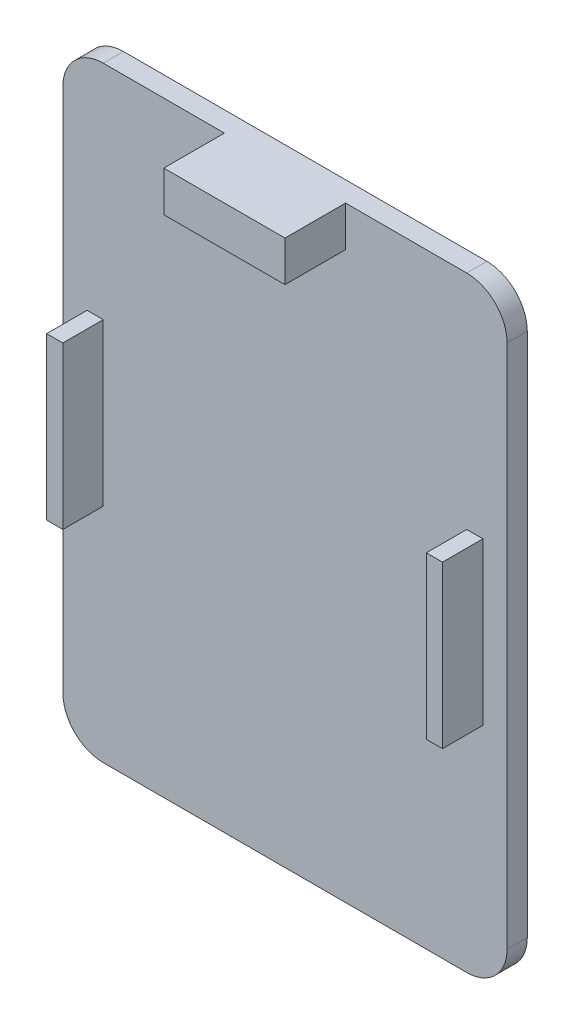
ISO-10303-21;
HEADER;
FILE_DESCRIPTION(('STEP AP214'),'2;1');
FILE_NAME('part.step','',(''),(''),'','','');
FILE_SCHEMA(('AUTOMOTIVE_DESIGN { 1 0 10303 214 1 1 1 1 }'));
ENDSEC;
DATA;
#1=APPLICATION_CONTEXT('core data for automotive mechanical design processes');
#2=APPLICATION_PROTOCOL_DEFINITION('international standard','automotive_design',2000,#1);
#3=PRODUCT_CONTEXT('',#1,'mechanical');
#4=PRODUCT('Part','Part','',(#3));
#5=PRODUCT_RELATED_PRODUCT_CATEGORY('part','',(#4));
#6=PRODUCT_DEFINITION_FORMATION('','',#4);
#7=PRODUCT_DEFINITION_CONTEXT('part definition',#1,'design');
#8=PRODUCT_DEFINITION('design','',#6,#7);
#9=PRODUCT_DEFINITION_SHAPE('','',#8);
#10=(LENGTH_UNIT() NAMED_UNIT(*) SI_UNIT(.MILLI.,.METRE.));
#11=(NAMED_UNIT(*) PLANE_ANGLE_UNIT() SI_UNIT($,.RADIAN.));
#12=(NAMED_UNIT(*) SI_UNIT($,.STERADIAN.) SOLID_ANGLE_UNIT());
#13=UNCERTAINTY_MEASURE_WITH_UNIT(LENGTH_MEASURE(1.E-05),#10,'distance_accuracy_value','');
#14=(GEOMETRIC_REPRESENTATION_CONTEXT(3) GLOBAL_UNCERTAINTY_ASSIGNED_CONTEXT((#13)) GLOBAL_UNIT_ASSIGNED_CONTEXT((#10,
#11,#12)) REPRESENTATION_CONTEXT('',''));
#15=CARTESIAN_POINT('',(0.,0.,0.));
#16=DIRECTION('',(0.,0.,1.));
#17=DIRECTION('',(1.,0.,0.));
#18=AXIS2_PLACEMENT_3D('',#15,#16,#17);
#19=CARTESIAN_POINT('',(4.5,6.5,0.5));
#20=DIRECTION('',(0.,0.,-1.));
#21=DIRECTION('',(-1.,0.,0.));
#22=AXIS2_PLACEMENT_3D('',#19,#20,#21);
#23=PLANE('',#22);
#24=DIRECTION('',(1.,0.,0.));
#25=VECTOR('',#24,1.);
#26=CARTESIAN_POINT('',(4.9,2.,0.5));
#27=LINE('',#26,#25);
#28=CARTESIAN_POINT('',(4.5,2.,0.5));
#29=VERTEX_POINT('',#28);
#30=CARTESIAN_POINT('',(4.9,2.,0.5));
#31=VERTEX_POINT('',#30);
#32=EDGE_CURVE('E204',#29,#31,#27,.T.);
#33=ORIENTED_EDGE('',*,*,#32,.T.);
#34=DIRECTION('',(0.,-1.,0.));
#35=VECTOR('',#34,1.);
#36=CARTESIAN_POINT('',(4.9,2.,0.5));
#37=LINE('',#36,#35);
#38=CARTESIAN_POINT('',(4.9,-2.,0.5));
#39=VERTEX_POINT('',#38);
#40=EDGE_CURVE('E178',#31,#39,#37,.T.);
#41=ORIENTED_EDGE('',*,*,#40,.T.);
#42=DIRECTION('',(-1.,0.,0.));
#43=VECTOR('',#42,1.);
#44=CARTESIAN_POINT('',(4.9,-2.,0.5));
#45=LINE('',#44,#43);
#46=CARTESIAN_POINT('',(4.5,-2.,0.5));
#47=VERTEX_POINT('',#46);
#48=EDGE_CURVE('E194',#39,#47,#45,.T.);
#49=ORIENTED_EDGE('',*,*,#48,.T.);
#50=DIRECTION('',(0.,1.,0.));
#51=VECTOR('',#50,1.);
#52=CARTESIAN_POINT('',(4.5,2.,0.5));
#53=LINE('',#52,#51);
#54=EDGE_CURVE('E50',#47,#29,#53,.T.);
#55=ORIENTED_EDGE('',*,*,#54,.T.);
#56=EDGE_LOOP('',(#33,#41,#49,#55));
#57=FACE_BOUND('',#56,.T.);
#58=DIRECTION('',(0.,-1.,0.));
#59=VECTOR('',#58,1.);
#60=CARTESIAN_POINT('',(-1.5,7.5,0.5));
#61=LINE('',#60,#59);
#62=CARTESIAN_POINT('',(-1.5,7.5,0.5));
#63=VERTEX_POINT('',#62);
#64=CARTESIAN_POINT('',(-1.5,6.5,0.5));
#65=VERTEX_POINT('',#64);
#66=EDGE_CURVE('E242',#63,#65,#61,.T.);
#67=ORIENTED_EDGE('',*,*,#66,.F.);
#68=DIRECTION('',(-1.,0.,0.));
#69=VECTOR('',#68,1.);
#70=CARTESIAN_POINT('',(-4.49999999999999,7.5,0.5));
#71=LINE('',#70,#69);
#72=CARTESIAN_POINT('',(-4.49999999999999,7.5,0.5));
#73=VERTEX_POINT('',#72);
#74=EDGE_CURVE('E282',#63,#73,#71,.T.);
#75=ORIENTED_EDGE('',*,*,#74,.T.);
#76=CARTESIAN_POINT('',(-4.5,6.5,0.5));
#77=DIRECTION('',(0.,0.,1.));
#78=DIRECTION('',(1.,0.,0.));
#79=AXIS2_PLACEMENT_3D('',#76,#77,#78);
#80=CIRCLE('',#79,1.);
#81=CARTESIAN_POINT('',(-5.5,6.49999999999999,0.5));
#82=VERTEX_POINT('',#81);
#83=EDGE_CURVE('E290',#73,#82,#80,.T.);
#84=ORIENTED_EDGE('',*,*,#83,.T.);
#85=DIRECTION('',(0.,-1.,0.));
#86=VECTOR('',#85,1.);
#87=CARTESIAN_POINT('',(-5.5,-6.5,0.5));
#88=LINE('',#87,#86);
#89=CARTESIAN_POINT('',(-5.5,-6.5,0.5));
#90=VERTEX_POINT('',#89);
#91=EDGE_CURVE('E293',#82,#90,#88,.T.);
#92=ORIENTED_EDGE('',*,*,#91,.T.);
#93=CARTESIAN_POINT('',(-4.5,-6.5,0.5));
#94=DIRECTION('',(0.,0.,1.));
#95=DIRECTION('',(-1.,0.,0.));
#96=AXIS2_PLACEMENT_3D('',#93,#94,#95);
#97=CIRCLE('',#96,1.);
#98=CARTESIAN_POINT('',(-4.49999999999999,-7.5,0.5));
#99=VERTEX_POINT('',#98);
#100=EDGE_CURVE('E295',#90,#99,#97,.T.);
#101=ORIENTED_EDGE('',*,*,#100,.T.);
#102=DIRECTION('',(1.,0.,0.));
#103=VECTOR('',#102,1.);
#104=CARTESIAN_POINT('',(-4.49999999999999,-7.5,0.5));
#105=LINE('',#104,#103);
#106=CARTESIAN_POINT('',(4.49999999999999,-7.5,0.5));
#107=VERTEX_POINT('',#106);
#108=EDGE_CURVE('E297',#99,#107,#105,.T.);
#109=ORIENTED_EDGE('',*,*,#108,.T.);
#110=CARTESIAN_POINT('',(4.5,-6.5,0.5));
#111=DIRECTION('',(0.,0.,1.));
#112=DIRECTION('',(-1.,0.,0.));
#113=AXIS2_PLACEMENT_3D('',#110,#111,#112);
#114=CIRCLE('',#113,1.);
#115=CARTESIAN_POINT('',(5.5,-6.5,0.5));
#116=VERTEX_POINT('',#115);
#117=EDGE_CURVE('E299',#107,#116,#114,.T.);
#118=ORIENTED_EDGE('',*,*,#117,.T.);
#119=DIRECTION('',(0.,1.,0.));
#120=VECTOR('',#119,1.);
#121=CARTESIAN_POINT('',(5.5,-6.5,0.5));
#122=LINE('',#121,#120);
#123=CARTESIAN_POINT('',(5.5,6.49999999999999,0.5));
#124=VERTEX_POINT('',#123);
#125=EDGE_CURVE('E301',#116,#124,#122,.T.);
#126=ORIENTED_EDGE('',*,*,#125,.T.);
#127=CARTESIAN_POINT('',(4.5,6.5,0.5));
#128=DIRECTION('',(0.,0.,1.));
#129=DIRECTION('',(-1.,0.,0.));
#130=AXIS2_PLACEMENT_3D('',#127,#128,#129);
#131=CIRCLE('',#130,1.);
#132=CARTESIAN_POINT('',(4.49999999999999,7.5,0.5));
#133=VERTEX_POINT('',#132);
#134=EDGE_CURVE('E286',#124,#133,#131,.T.);
#135=ORIENTED_EDGE('',*,*,#134,.T.);
#136=CARTESIAN_POINT('',(1.5,7.5,0.5));
#137=VERTEX_POINT('',#136);
#138=EDGE_CURVE('E285',#133,#137,#71,.T.);
#139=ORIENTED_EDGE('',*,*,#138,.T.);
#140=DIRECTION('',(0.,1.,0.));
#141=VECTOR('',#140,1.);
#142=CARTESIAN_POINT('',(1.5,7.5,0.5));
#143=LINE('',#142,#141);
#144=CARTESIAN_POINT('',(1.5,6.5,0.5));
#145=VERTEX_POINT('',#144);
#146=EDGE_CURVE('E247',#145,#137,#143,.T.);
#147=ORIENTED_EDGE('',*,*,#146,.F.);
#148=DIRECTION('',(1.,0.,0.));
#149=VECTOR('',#148,1.);
#150=CARTESIAN_POINT('',(-1.5,6.5,0.5));
#151=LINE('',#150,#149);
#152=EDGE_CURVE('E254',#65,#145,#151,.T.);
#153=ORIENTED_EDGE('',*,*,#152,.F.);
#154=EDGE_LOOP('',(#67,#75,#84,#92,#101,#109,#118,#126,#135,#139,#147,#153));
#155=FACE_BOUND('',#154,.T.);
#156=DIRECTION('',(0.,-1.,0.));
#157=VECTOR('',#156,1.);
#158=CARTESIAN_POINT('',(-4.9,2.,0.5));
#159=LINE('',#158,#157);
#160=CARTESIAN_POINT('',(-4.9,2.,0.5));
#161=VERTEX_POINT('',#160);
#162=CARTESIAN_POINT('',(-4.9,-2.,0.5));
#163=VERTEX_POINT('',#162);
#164=EDGE_CURVE('E183',#161,#163,#159,.T.);
#165=ORIENTED_EDGE('',*,*,#164,.F.);
#166=DIRECTION('',(-1.,0.,0.));
#167=VECTOR('',#166,1.);
#168=CARTESIAN_POINT('',(-4.9,2.,0.5));
#169=LINE('',#168,#167);
#170=CARTESIAN_POINT('',(-4.5,2.,0.5));
#171=VERTEX_POINT('',#170);
#172=EDGE_CURVE('E217',#171,#161,#169,.T.);
#173=ORIENTED_EDGE('',*,*,#172,.F.);
#174=DIRECTION('',(0.,1.,0.));
#175=VECTOR('',#174,1.);
#176=CARTESIAN_POINT('',(-4.5,2.,0.5));
#177=LINE('',#176,#175);
#178=CARTESIAN_POINT('',(-4.5,-2.,0.5));
#179=VERTEX_POINT('',#178);
#180=EDGE_CURVE('E227',#179,#171,#177,.T.);
#181=ORIENTED_EDGE('',*,*,#180,.F.);
#182=DIRECTION('',(1.,0.,0.));
#183=VECTOR('',#182,1.);
#184=CARTESIAN_POINT('',(-4.9,-2.,0.5));
#185=LINE('',#184,#183);
#186=EDGE_CURVE('E58',#163,#179,#185,.T.);
#187=ORIENTED_EDGE('',*,*,#186,.F.);
#188=EDGE_LOOP('',(#165,#173,#181,#187));
#189=FACE_BOUND('',#188,.T.);
#190=ADVANCED_FACE('F33',(#57,#155,#189),#23,.F.);
#191=CARTESIAN_POINT('',(4.5,6.5,0.5));
#192=DIRECTION('',(0.,0.,-1.));
#193=DIRECTION('',(-1.,0.,0.));
#194=AXIS2_PLACEMENT_3D('',#191,#192,#193);
#195=CYLINDRICAL_SURFACE('',#194,1.);
#196=CARTESIAN_POINT('',(4.5,6.5,0.));
#197=DIRECTION('',(0.,0.,1.));
#198=DIRECTION('',(-1.,0.,0.));
#199=AXIS2_PLACEMENT_3D('',#196,#197,#198);
#200=CIRCLE('',#199,1.);
#201=CARTESIAN_POINT('',(5.5,6.49999999999999,0.));
#202=VERTEX_POINT('',#201);
#203=CARTESIAN_POINT('',(4.49999999999999,7.5,0.));
#204=VERTEX_POINT('',#203);
#205=EDGE_CURVE('E304',#202,#204,#200,.T.);
#206=ORIENTED_EDGE('',*,*,#205,.T.);
#207=DIRECTION('',(0.,0.,-1.));
#208=VECTOR('',#207,1.);
#209=CARTESIAN_POINT('',(4.49999999999999,7.5,0.5));
#210=LINE('',#209,#208);
#211=EDGE_CURVE('E11',#133,#204,#210,.T.);
#212=ORIENTED_EDGE('',*,*,#211,.F.);
#213=ORIENTED_EDGE('',*,*,#134,.F.);
#214=DIRECTION('',(0.,0.,-1.));
#215=VECTOR('',#214,1.);
#216=CARTESIAN_POINT('',(5.5,6.49999999999999,0.5));
#217=LINE('',#216,#215);
#218=EDGE_CURVE('E303',#124,#202,#217,.T.);
#219=ORIENTED_EDGE('',*,*,#218,.T.);
#220=EDGE_LOOP('',(#206,#212,#213,#219));
#221=FACE_BOUND('',#220,.T.);
#222=ADVANCED_FACE('F35',(#221),#195,.T.);
#223=CARTESIAN_POINT('',(-4.49999999999999,7.5,0.5));
#224=DIRECTION('',(0.,-1.,0.));
#225=DIRECTION('',(0.,0.,-1.));
#226=AXIS2_PLACEMENT_3D('',#223,#224,#225);
#227=PLANE('',#226);
#228=DIRECTION('',(-1.,0.,0.));
#229=VECTOR('',#228,1.);
#230=CARTESIAN_POINT('',(-4.49999999999999,7.5,0.));
#231=LINE('',#230,#229);
#232=CARTESIAN_POINT('',(-4.49999999999999,7.5,0.));
#233=VERTEX_POINT('',#232);
#234=EDGE_CURVE('E307',#204,#233,#231,.T.);
#235=ORIENTED_EDGE('',*,*,#234,.T.);
#236=DIRECTION('',(0.,0.,-1.));
#237=VECTOR('',#236,1.);
#238=CARTESIAN_POINT('',(-4.49999999999999,7.5,0.5));
#239=LINE('',#238,#237);
#240=EDGE_CURVE('E42',#73,#233,#239,.T.);
#241=ORIENTED_EDGE('',*,*,#240,.F.);
#242=ORIENTED_EDGE('',*,*,#74,.F.);
#243=DIRECTION('',(0.,0.,-1.));
#244=VECTOR('',#243,1.);
#245=CARTESIAN_POINT('',(-1.5,7.5,2.));
#246=LINE('',#245,#244);
#247=CARTESIAN_POINT('',(-1.5,7.5,2.));
#248=VERTEX_POINT('',#247);
#249=EDGE_CURVE('E253',#248,#63,#246,.T.);
#250=ORIENTED_EDGE('',*,*,#249,.F.);
#251=DIRECTION('',(-1.,0.,0.));
#252=VECTOR('',#251,1.);
#253=CARTESIAN_POINT('',(-1.5,7.5,2.));
#254=LINE('',#253,#252);
#255=CARTESIAN_POINT('',(1.5,7.5,2.));
#256=VERTEX_POINT('',#255);
#257=EDGE_CURVE('E251',#256,#248,#254,.T.);
#258=ORIENTED_EDGE('',*,*,#257,.F.);
#259=DIRECTION('',(0.,0.,-1.));
#260=VECTOR('',#259,1.);
#261=CARTESIAN_POINT('',(1.5,7.5,2.));
#262=LINE('',#261,#260);
#263=EDGE_CURVE('E266',#256,#137,#262,.T.);
#264=ORIENTED_EDGE('',*,*,#263,.T.);
#265=ORIENTED_EDGE('',*,*,#138,.F.);
#266=ORIENTED_EDGE('',*,*,#211,.T.);
#267=EDGE_LOOP('',(#235,#241,#242,#250,#258,#264,#265,#266));
#268=FACE_BOUND('',#267,.T.);
#269=ADVANCED_FACE('F363',(#268),#227,.F.);
#270=CARTESIAN_POINT('',(-4.5,6.5,0.5));
#271=DIRECTION('',(0.,0.,-1.));
#272=DIRECTION('',(-1.,0.,0.));
#273=AXIS2_PLACEMENT_3D('',#270,#271,#272);
#274=CYLINDRICAL_SURFACE('',#273,1.);
#275=CARTESIAN_POINT('',(-4.5,6.5,0.));
#276=DIRECTION('',(0.,0.,1.));
#277=DIRECTION('',(1.,0.,0.));
#278=AXIS2_PLACEMENT_3D('',#275,#276,#277);
#279=CIRCLE('',#278,1.);
#280=CARTESIAN_POINT('',(-5.5,6.49999999999999,0.));
#281=VERTEX_POINT('',#280);
#282=EDGE_CURVE('E309',#233,#281,#279,.T.);
#283=ORIENTED_EDGE('',*,*,#282,.T.);
#284=DIRECTION('',(0.,0.,-1.));
#285=VECTOR('',#284,1.);
#286=CARTESIAN_POINT('',(-5.5,6.49999999999999,0.5));
#287=LINE('',#286,#285);
#288=EDGE_CURVE('E335',#82,#281,#287,.T.);
#289=ORIENTED_EDGE('',*,*,#288,.F.);
#290=ORIENTED_EDGE('',*,*,#83,.F.);
#291=ORIENTED_EDGE('',*,*,#240,.T.);
#292=EDGE_LOOP('',(#283,#289,#290,#291));
#293=FACE_BOUND('',#292,.T.);
#294=ADVANCED_FACE('F343',(#293),#274,.T.);
#295=CARTESIAN_POINT('',(-5.5,-6.5,0.5));
#296=DIRECTION('',(1.,0.,0.));
#297=DIRECTION('',(0.,0.,-1.));
#298=AXIS2_PLACEMENT_3D('',#295,#296,#297);
#299=PLANE('',#298);
#300=DIRECTION('',(0.,-1.,0.));
#301=VECTOR('',#300,1.);
#302=CARTESIAN_POINT('',(-5.5,-6.5,0.));
#303=LINE('',#302,#301);
#304=CARTESIAN_POINT('',(-5.5,-6.5,0.));
#305=VERTEX_POINT('',#304);
#306=EDGE_CURVE('E311',#281,#305,#303,.T.);
#307=ORIENTED_EDGE('',*,*,#306,.T.);
#308=DIRECTION('',(0.,0.,-1.));
#309=VECTOR('',#308,1.);
#310=CARTESIAN_POINT('',(-5.5,-6.5,0.5));
#311=LINE('',#310,#309);
#312=EDGE_CURVE('E332',#90,#305,#311,.T.);
#313=ORIENTED_EDGE('',*,*,#312,.F.);
#314=ORIENTED_EDGE('',*,*,#91,.F.);
#315=ORIENTED_EDGE('',*,*,#288,.T.);
#316=EDGE_LOOP('',(#307,#313,#314,#315));
#317=FACE_BOUND('',#316,.T.);
#318=ADVANCED_FACE('F354',(#317),#299,.F.);
#319=CARTESIAN_POINT('',(-4.5,-6.5,0.5));
#320=DIRECTION('',(0.,0.,-1.));
#321=DIRECTION('',(-1.,0.,0.));
#322=AXIS2_PLACEMENT_3D('',#319,#320,#321);
#323=CYLINDRICAL_SURFACE('',#322,1.);
#324=CARTESIAN_POINT('',(-4.5,-6.5,0.));
#325=DIRECTION('',(0.,0.,1.));
#326=DIRECTION('',(-1.,0.,0.));
#327=AXIS2_PLACEMENT_3D('',#324,#325,#326);
#328=CIRCLE('',#327,1.);
#329=CARTESIAN_POINT('',(-4.49999999999999,-7.5,0.));
#330=VERTEX_POINT('',#329);
#331=EDGE_CURVE('E313',#305,#330,#328,.T.);
#332=ORIENTED_EDGE('',*,*,#331,.T.);
#333=DIRECTION('',(0.,0.,-1.));
#334=VECTOR('',#333,1.);
#335=CARTESIAN_POINT('',(-4.49999999999999,-7.5,0.5));
#336=LINE('',#335,#334);
#337=EDGE_CURVE('E329',#99,#330,#336,.T.);
#338=ORIENTED_EDGE('',*,*,#337,.F.);
#339=ORIENTED_EDGE('',*,*,#100,.F.);
#340=ORIENTED_EDGE('',*,*,#312,.T.);
#341=EDGE_LOOP('',(#332,#338,#339,#340));
#342=FACE_BOUND('',#341,.T.);
#343=ADVANCED_FACE('F358',(#342),#323,.T.);
#344=CARTESIAN_POINT('',(-4.49999999999999,-7.5,0.5));
#345=DIRECTION('',(0.,1.,0.));
#346=DIRECTION('',(0.,0.,1.));
#347=AXIS2_PLACEMENT_3D('',#344,#345,#346);
#348=PLANE('',#347);
#349=DIRECTION('',(1.,0.,0.));
#350=VECTOR('',#349,1.);
#351=CARTESIAN_POINT('',(-4.49999999999999,-7.5,0.));
#352=LINE('',#351,#350);
#353=CARTESIAN_POINT('',(4.49999999999999,-7.5,0.));
#354=VERTEX_POINT('',#353);
#355=EDGE_CURVE('E315',#330,#354,#352,.T.);
#356=ORIENTED_EDGE('',*,*,#355,.T.);
#357=DIRECTION('',(0.,0.,-1.));
#358=VECTOR('',#357,1.);
#359=CARTESIAN_POINT('',(4.49999999999999,-7.5,0.5));
#360=LINE('',#359,#358);
#361=EDGE_CURVE('E326',#107,#354,#360,.T.);
#362=ORIENTED_EDGE('',*,*,#361,.F.);
#363=ORIENTED_EDGE('',*,*,#108,.F.);
#364=ORIENTED_EDGE('',*,*,#337,.T.);
#365=EDGE_LOOP('',(#356,#362,#363,#364));
#366=FACE_BOUND('',#365,.T.);
#367=ADVANCED_FACE('F401',(#366),#348,.F.);
#368=CARTESIAN_POINT('',(4.5,-6.5,0.5));
#369=DIRECTION('',(0.,0.,-1.));
#370=DIRECTION('',(-1.,0.,0.));
#371=AXIS2_PLACEMENT_3D('',#368,#369,#370);
#372=CYLINDRICAL_SURFACE('',#371,1.);
#373=CARTESIAN_POINT('',(4.5,-6.5,0.));
#374=DIRECTION('',(0.,0.,1.));
#375=DIRECTION('',(-1.,0.,0.));
#376=AXIS2_PLACEMENT_3D('',#373,#374,#375);
#377=CIRCLE('',#376,1.);
#378=CARTESIAN_POINT('',(5.5,-6.5,0.));
#379=VERTEX_POINT('',#378);
#380=EDGE_CURVE('E317',#354,#379,#377,.T.);
#381=ORIENTED_EDGE('',*,*,#380,.T.);
#382=DIRECTION('',(0.,0.,-1.));
#383=VECTOR('',#382,1.);
#384=CARTESIAN_POINT('',(5.5,-6.5,0.5));
#385=LINE('',#384,#383);
#386=EDGE_CURVE('E323',#116,#379,#385,.T.);
#387=ORIENTED_EDGE('',*,*,#386,.F.);
#388=ORIENTED_EDGE('',*,*,#117,.F.);
#389=ORIENTED_EDGE('',*,*,#361,.T.);
#390=EDGE_LOOP('',(#381,#387,#388,#389));
#391=FACE_BOUND('',#390,.T.);
#392=ADVANCED_FACE('F397',(#391),#372,.T.);
#393=CARTESIAN_POINT('',(5.5,-6.5,0.5));
#394=DIRECTION('',(-1.,0.,0.));
#395=DIRECTION('',(0.,0.,1.));
#396=AXIS2_PLACEMENT_3D('',#393,#394,#395);
#397=PLANE('',#396);
#398=DIRECTION('',(0.,1.,0.));
#399=VECTOR('',#398,1.);
#400=CARTESIAN_POINT('',(5.5,-6.5,0.));
#401=LINE('',#400,#399);
#402=EDGE_CURVE('E319',#379,#202,#401,.T.);
#403=ORIENTED_EDGE('',*,*,#402,.T.);
#404=ORIENTED_EDGE('',*,*,#218,.F.);
#405=ORIENTED_EDGE('',*,*,#125,.F.);
#406=ORIENTED_EDGE('',*,*,#386,.T.);
#407=EDGE_LOOP('',(#403,#404,#405,#406));
#408=FACE_BOUND('',#407,.T.);
#409=ADVANCED_FACE('F394',(#408),#397,.F.);
#410=CARTESIAN_POINT('',(4.5,6.5,0.));
#411=DIRECTION('',(0.,0.,-1.));
#412=DIRECTION('',(-1.,0.,0.));
#413=AXIS2_PLACEMENT_3D('',#410,#411,#412);
#414=PLANE('',#413);
#415=ORIENTED_EDGE('',*,*,#205,.F.);
#416=ORIENTED_EDGE('',*,*,#402,.F.);
#417=ORIENTED_EDGE('',*,*,#380,.F.);
#418=ORIENTED_EDGE('',*,*,#355,.F.);
#419=ORIENTED_EDGE('',*,*,#331,.F.);
#420=ORIENTED_EDGE('',*,*,#306,.F.);
#421=ORIENTED_EDGE('',*,*,#282,.F.);
#422=ORIENTED_EDGE('',*,*,#234,.F.);
#423=EDGE_LOOP('',(#415,#416,#417,#418,#419,#420,#421,#422));
#424=FACE_BOUND('',#423,.T.);
#425=ADVANCED_FACE('F349',(#424),#414,.T.);
#426=CARTESIAN_POINT('',(-1.5,7.5,2.));
#427=DIRECTION('',(1.,0.,0.));
#428=DIRECTION('',(0.,1.,0.));
#429=AXIS2_PLACEMENT_3D('',#426,#427,#428);
#430=PLANE('',#429);
#431=ORIENTED_EDGE('',*,*,#66,.T.);
#432=DIRECTION('',(0.,0.,-1.));
#433=VECTOR('',#432,1.);
#434=CARTESIAN_POINT('',(-1.5,6.5,2.));
#435=LINE('',#434,#433);
#436=CARTESIAN_POINT('',(-1.5,6.5,2.));
#437=VERTEX_POINT('',#436);
#438=EDGE_CURVE('E272',#437,#65,#435,.T.);
#439=ORIENTED_EDGE('',*,*,#438,.F.);
#440=DIRECTION('',(0.,-1.,0.));
#441=VECTOR('',#440,1.);
#442=CARTESIAN_POINT('',(-1.5,7.5,2.));
#443=LINE('',#442,#441);
#444=EDGE_CURVE('E243',#248,#437,#443,.T.);
#445=ORIENTED_EDGE('',*,*,#444,.F.);
#446=ORIENTED_EDGE('',*,*,#249,.T.);
#447=EDGE_LOOP('',(#431,#439,#445,#446));
#448=FACE_BOUND('',#447,.T.);
#449=ADVANCED_FACE('F365',(#448),#430,.F.);
#450=CARTESIAN_POINT('',(-1.5,6.5,2.));
#451=DIRECTION('',(0.,1.,0.));
#452=DIRECTION('',(0.,0.,1.));
#453=AXIS2_PLACEMENT_3D('',#450,#451,#452);
#454=PLANE('',#453);
#455=ORIENTED_EDGE('',*,*,#152,.T.);
#456=DIRECTION('',(0.,0.,-1.));
#457=VECTOR('',#456,1.);
#458=CARTESIAN_POINT('',(1.5,6.5,2.));
#459=LINE('',#458,#457);
#460=CARTESIAN_POINT('',(1.5,6.5,2.));
#461=VERTEX_POINT('',#460);
#462=EDGE_CURVE('E259',#461,#145,#459,.T.);
#463=ORIENTED_EDGE('',*,*,#462,.F.);
#464=DIRECTION('',(1.,0.,0.));
#465=VECTOR('',#464,1.);
#466=CARTESIAN_POINT('',(-1.5,6.5,2.));
#467=LINE('',#466,#465);
#468=EDGE_CURVE('E246',#437,#461,#467,.T.);
#469=ORIENTED_EDGE('',*,*,#468,.F.);
#470=ORIENTED_EDGE('',*,*,#438,.T.);
#471=EDGE_LOOP('',(#455,#463,#469,#470));
#472=FACE_BOUND('',#471,.T.);
#473=ADVANCED_FACE('F375',(#472),#454,.F.);
#474=CARTESIAN_POINT('',(1.5,7.5,2.));
#475=DIRECTION('',(-1.,0.,0.));
#476=DIRECTION('',(0.,-1.,0.));
#477=AXIS2_PLACEMENT_3D('',#474,#475,#476);
#478=PLANE('',#477);
#479=ORIENTED_EDGE('',*,*,#146,.T.);
#480=ORIENTED_EDGE('',*,*,#263,.F.);
#481=DIRECTION('',(0.,1.,0.));
#482=VECTOR('',#481,1.);
#483=CARTESIAN_POINT('',(1.5,7.5,2.));
#484=LINE('',#483,#482);
#485=EDGE_CURVE('E249',#461,#256,#484,.T.);
#486=ORIENTED_EDGE('',*,*,#485,.F.);
#487=ORIENTED_EDGE('',*,*,#462,.T.);
#488=EDGE_LOOP('',(#479,#480,#486,#487));
#489=FACE_BOUND('',#488,.T.);
#490=ADVANCED_FACE('F372',(#489),#478,.F.);
#491=CARTESIAN_POINT('',(0.,0.,2.));
#492=DIRECTION('',(0.,0.,1.));
#493=DIRECTION('',(1.,0.,0.));
#494=AXIS2_PLACEMENT_3D('',#491,#492,#493);
#495=PLANE('',#494);
#496=ORIENTED_EDGE('',*,*,#444,.T.);
#497=ORIENTED_EDGE('',*,*,#468,.T.);
#498=ORIENTED_EDGE('',*,*,#485,.T.);
#499=ORIENTED_EDGE('',*,*,#257,.T.);
#500=EDGE_LOOP('',(#496,#497,#498,#499));
#501=FACE_BOUND('',#500,.T.);
#502=ADVANCED_FACE('F368',(#501),#495,.T.);
#503=CARTESIAN_POINT('',(-4.9,2.,1.5));
#504=DIRECTION('',(1.,0.,0.));
#505=DIRECTION('',(0.,1.,0.));
#506=AXIS2_PLACEMENT_3D('',#503,#504,#505);
#507=PLANE('',#506);
#508=ORIENTED_EDGE('',*,*,#164,.T.);
#509=DIRECTION('',(0.,0.,-1.));
#510=VECTOR('',#509,1.);
#511=CARTESIAN_POINT('',(-4.9,-2.,1.5));
#512=LINE('',#511,#510);
#513=CARTESIAN_POINT('',(-4.9,-2.,1.5));
#514=VERTEX_POINT('',#513);
#515=EDGE_CURVE('E240',#514,#163,#512,.T.);
#516=ORIENTED_EDGE('',*,*,#515,.F.);
#517=DIRECTION('',(0.,-1.,0.));
#518=VECTOR('',#517,1.);
#519=CARTESIAN_POINT('',(-4.9,2.,1.5));
#520=LINE('',#519,#518);
#521=CARTESIAN_POINT('',(-4.9,2.,1.5));
#522=VERTEX_POINT('',#521);
#523=EDGE_CURVE('E213',#522,#514,#520,.T.);
#524=ORIENTED_EDGE('',*,*,#523,.F.);
#525=DIRECTION('',(0.,0.,-1.));
#526=VECTOR('',#525,1.);
#527=CARTESIAN_POINT('',(-4.9,2.,1.5));
#528=LINE('',#527,#526);
#529=EDGE_CURVE('E223',#522,#161,#528,.T.);
#530=ORIENTED_EDGE('',*,*,#529,.T.);
#531=EDGE_LOOP('',(#508,#516,#524,#530));
#532=FACE_BOUND('',#531,.T.);
#533=ADVANCED_FACE('F467',(#532),#507,.F.);
#534=CARTESIAN_POINT('',(-4.9,-2.,1.5));
#535=DIRECTION('',(0.,1.,0.));
#536=DIRECTION('',(0.,0.,1.));
#537=AXIS2_PLACEMENT_3D('',#534,#535,#536);
#538=PLANE('',#537);
#539=ORIENTED_EDGE('',*,*,#186,.T.);
#540=DIRECTION('',(0.,0.,-1.));
#541=VECTOR('',#540,1.);
#542=CARTESIAN_POINT('',(-4.5,-2.,1.5));
#543=LINE('',#542,#541);
#544=CARTESIAN_POINT('',(-4.5,-2.,1.5));
#545=VERTEX_POINT('',#544);
#546=EDGE_CURVE('E237',#545,#179,#543,.T.);
#547=ORIENTED_EDGE('',*,*,#546,.F.);
#548=DIRECTION('',(1.,0.,0.));
#549=VECTOR('',#548,1.);
#550=CARTESIAN_POINT('',(-4.9,-2.,1.5));
#551=LINE('',#550,#549);
#552=EDGE_CURVE('E216',#514,#545,#551,.T.);
#553=ORIENTED_EDGE('',*,*,#552,.F.);
#554=ORIENTED_EDGE('',*,*,#515,.T.);
#555=EDGE_LOOP('',(#539,#547,#553,#554));
#556=FACE_BOUND('',#555,.T.);
#557=ADVANCED_FACE('F477',(#556),#538,.F.);
#558=CARTESIAN_POINT('',(-4.5,2.,1.5));
#559=DIRECTION('',(-1.,0.,0.));
#560=DIRECTION('',(0.,-1.,0.));
#561=AXIS2_PLACEMENT_3D('',#558,#559,#560);
#562=PLANE('',#561);
#563=ORIENTED_EDGE('',*,*,#180,.T.);
#564=DIRECTION('',(0.,0.,-1.));
#565=VECTOR('',#564,1.);
#566=CARTESIAN_POINT('',(-4.5,2.,1.5));
#567=LINE('',#566,#565);
#568=CARTESIAN_POINT('',(-4.5,2.,1.5));
#569=VERTEX_POINT('',#568);
#570=EDGE_CURVE('E234',#569,#171,#567,.T.);
#571=ORIENTED_EDGE('',*,*,#570,.F.);
#572=DIRECTION('',(0.,1.,0.));
#573=VECTOR('',#572,1.);
#574=CARTESIAN_POINT('',(-4.5,2.,1.5));
#575=LINE('',#574,#573);
#576=EDGE_CURVE('E219',#545,#569,#575,.T.);
#577=ORIENTED_EDGE('',*,*,#576,.F.);
#578=ORIENTED_EDGE('',*,*,#546,.T.);
#579=EDGE_LOOP('',(#563,#571,#577,#578));
#580=FACE_BOUND('',#579,.T.);
#581=ADVANCED_FACE('F487',(#580),#562,.F.);
#582=CARTESIAN_POINT('',(-4.9,2.,1.5));
#583=DIRECTION('',(0.,-1.,0.));
#584=DIRECTION('',(0.,0.,-1.));
#585=AXIS2_PLACEMENT_3D('',#582,#583,#584);
#586=PLANE('',#585);
#587=ORIENTED_EDGE('',*,*,#172,.T.);
#588=ORIENTED_EDGE('',*,*,#529,.F.);
#589=DIRECTION('',(-1.,0.,0.));
#590=VECTOR('',#589,1.);
#591=CARTESIAN_POINT('',(-4.9,2.,1.5));
#592=LINE('',#591,#590);
#593=EDGE_CURVE('E221',#569,#522,#592,.T.);
#594=ORIENTED_EDGE('',*,*,#593,.F.);
#595=ORIENTED_EDGE('',*,*,#570,.T.);
#596=EDGE_LOOP('',(#587,#588,#594,#595));
#597=FACE_BOUND('',#596,.T.);
#598=ADVANCED_FACE('F497',(#597),#586,.F.);
#599=CARTESIAN_POINT('',(0.,0.,1.5));
#600=DIRECTION('',(0.,0.,1.));
#601=DIRECTION('',(1.,0.,0.));
#602=AXIS2_PLACEMENT_3D('',#599,#600,#601);
#603=PLANE('',#602);
#604=ORIENTED_EDGE('',*,*,#523,.T.);
#605=ORIENTED_EDGE('',*,*,#552,.T.);
#606=ORIENTED_EDGE('',*,*,#576,.T.);
#607=ORIENTED_EDGE('',*,*,#593,.T.);
#608=EDGE_LOOP('',(#604,#605,#606,#607));
#609=FACE_BOUND('',#608,.T.);
#610=ADVANCED_FACE('F507',(#609),#603,.T.);
#611=CARTESIAN_POINT('',(4.9,2.,1.5));
#612=DIRECTION('',(1.,0.,0.));
#613=DIRECTION('',(0.,1.,0.));
#614=AXIS2_PLACEMENT_3D('',#611,#612,#613);
#615=PLANE('',#614);
#616=ORIENTED_EDGE('',*,*,#40,.F.);
#617=DIRECTION('',(0.,0.,-1.));
#618=VECTOR('',#617,1.);
#619=CARTESIAN_POINT('',(4.9,2.,1.5));
#620=LINE('',#619,#618);
#621=CARTESIAN_POINT('',(4.9,2.,1.5));
#622=VERTEX_POINT('',#621);
#623=EDGE_CURVE('E172',#622,#31,#620,.T.);
#624=ORIENTED_EDGE('',*,*,#623,.F.);
#625=DIRECTION('',(0.,-1.,0.));
#626=VECTOR('',#625,1.);
#627=CARTESIAN_POINT('',(4.9,2.,1.5));
#628=LINE('',#627,#626);
#629=CARTESIAN_POINT('',(4.9,-2.,1.5));
#630=VERTEX_POINT('',#629);
#631=EDGE_CURVE('E175',#622,#630,#628,.T.);
#632=ORIENTED_EDGE('',*,*,#631,.T.);
#633=DIRECTION('',(0.,0.,-1.));
#634=VECTOR('',#633,1.);
#635=CARTESIAN_POINT('',(4.9,-2.,1.5));
#636=LINE('',#635,#634);
#637=EDGE_CURVE('E202',#630,#39,#636,.T.);
#638=ORIENTED_EDGE('',*,*,#637,.T.);
#639=EDGE_LOOP('',(#616,#624,#632,#638));
#640=FACE_BOUND('',#639,.T.);
#641=ADVANCED_FACE('F174',(#640),#615,.T.);
#642=CARTESIAN_POINT('',(4.9,2.,1.5));
#643=DIRECTION('',(0.,1.,0.));
#644=DIRECTION('',(0.,0.,1.));
#645=AXIS2_PLACEMENT_3D('',#642,#643,#644);
#646=PLANE('',#645);
#647=ORIENTED_EDGE('',*,*,#32,.F.);
#648=DIRECTION('',(0.,0.,-1.));
#649=VECTOR('',#648,1.);
#650=CARTESIAN_POINT('',(4.5,2.,1.5));
#651=LINE('',#650,#649);
#652=CARTESIAN_POINT('',(4.5,2.,1.5));
#653=VERTEX_POINT('',#652);
#654=EDGE_CURVE('E184',#653,#29,#651,.T.);
#655=ORIENTED_EDGE('',*,*,#654,.F.);
#656=DIRECTION('',(1.,0.,0.));
#657=VECTOR('',#656,1.);
#658=CARTESIAN_POINT('',(4.9,2.,1.5));
#659=LINE('',#658,#657);
#660=EDGE_CURVE('E190',#653,#622,#659,.T.);
#661=ORIENTED_EDGE('',*,*,#660,.T.);
#662=ORIENTED_EDGE('',*,*,#623,.T.);
#663=EDGE_LOOP('',(#647,#655,#661,#662));
#664=FACE_BOUND('',#663,.T.);
#665=ADVANCED_FACE('F196',(#664),#646,.T.);
#666=CARTESIAN_POINT('',(4.5,2.,1.5));
#667=DIRECTION('',(-1.,0.,0.));
#668=DIRECTION('',(0.,-1.,0.));
#669=AXIS2_PLACEMENT_3D('',#666,#667,#668);
#670=PLANE('',#669);
#671=ORIENTED_EDGE('',*,*,#54,.F.);
#672=DIRECTION('',(0.,0.,-1.));
#673=VECTOR('',#672,1.);
#674=CARTESIAN_POINT('',(4.5,-2.,1.5));
#675=LINE('',#674,#673);
#676=CARTESIAN_POINT('',(4.5,-2.,1.5));
#677=VERTEX_POINT('',#676);
#678=EDGE_CURVE('E210',#677,#47,#675,.T.);
#679=ORIENTED_EDGE('',*,*,#678,.F.);
#680=DIRECTION('',(0.,1.,0.));
#681=VECTOR('',#680,1.);
#682=CARTESIAN_POINT('',(4.5,2.,1.5));
#683=LINE('',#682,#681);
#684=EDGE_CURVE('E197',#677,#653,#683,.T.);
#685=ORIENTED_EDGE('',*,*,#684,.T.);
#686=ORIENTED_EDGE('',*,*,#654,.T.);
#687=EDGE_LOOP('',(#671,#679,#685,#686));
#688=FACE_BOUND('',#687,.T.);
#689=ADVANCED_FACE('F537',(#688),#670,.T.);
#690=CARTESIAN_POINT('',(4.9,-2.,1.5));
#691=DIRECTION('',(0.,-1.,0.));
#692=DIRECTION('',(0.,0.,-1.));
#693=AXIS2_PLACEMENT_3D('',#690,#691,#692);
#694=PLANE('',#693);
#695=ORIENTED_EDGE('',*,*,#48,.F.);
#696=ORIENTED_EDGE('',*,*,#637,.F.);
#697=DIRECTION('',(-1.,0.,0.));
#698=VECTOR('',#697,1.);
#699=CARTESIAN_POINT('',(4.9,-2.,1.5));
#700=LINE('',#699,#698);
#701=EDGE_CURVE('E193',#630,#677,#700,.T.);
#702=ORIENTED_EDGE('',*,*,#701,.T.);
#703=ORIENTED_EDGE('',*,*,#678,.T.);
#704=EDGE_LOOP('',(#695,#696,#702,#703));
#705=FACE_BOUND('',#704,.T.);
#706=ADVANCED_FACE('F546',(#705),#694,.T.);
#707=CARTESIAN_POINT('',(0.,0.,1.5));
#708=DIRECTION('',(0.,0.,1.));
#709=DIRECTION('',(-1.,0.,0.));
#710=AXIS2_PLACEMENT_3D('',#707,#708,#709);
#711=PLANE('',#710);
#712=ORIENTED_EDGE('',*,*,#631,.F.);
#713=ORIENTED_EDGE('',*,*,#660,.F.);
#714=ORIENTED_EDGE('',*,*,#684,.F.);
#715=ORIENTED_EDGE('',*,*,#701,.F.);
#716=EDGE_LOOP('',(#712,#713,#714,#715));
#717=FACE_BOUND('',#716,.T.);
#718=ADVANCED_FACE('F188',(#717),#711,.T.);
#719=CLOSED_SHELL('',(#190,#222,#269,#294,#318,#343,#367,#392,#409,#425,#449,#473,#490,#502,
#533,#557,#581,#598,#610,#641,#665,#689,#706,#718));
#720=MANIFOLD_SOLID_BREP('B2',#719);
#721=ADVANCED_BREP_SHAPE_REPRESENTATION('',(#18,#720),#14);
#722=SHAPE_DEFINITION_REPRESENTATION(#9,#721);
ENDSEC;
END-ISO-10303-21;
